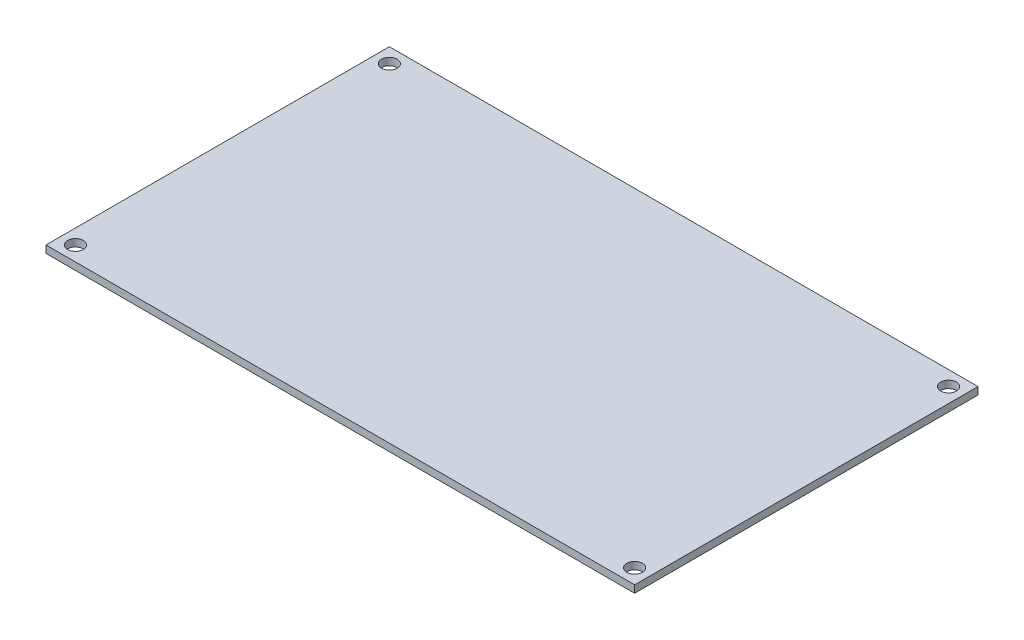
ISO-10303-21;
HEADER;
FILE_DESCRIPTION(('STEP AP214'),'2;1');
FILE_NAME('part.step','',(''),(''),'','','');
FILE_SCHEMA(('AUTOMOTIVE_DESIGN { 1 0 10303 214 1 1 1 1 }'));
ENDSEC;
DATA;
#1=APPLICATION_CONTEXT('core data for automotive mechanical design processes');
#2=APPLICATION_PROTOCOL_DEFINITION('international standard','automotive_design',2000,#1);
#3=PRODUCT_CONTEXT('',#1,'mechanical');
#4=PRODUCT('Part','Part','',(#3));
#5=PRODUCT_RELATED_PRODUCT_CATEGORY('part','',(#4));
#6=PRODUCT_DEFINITION_FORMATION('','',#4);
#7=PRODUCT_DEFINITION_CONTEXT('part definition',#1,'design');
#8=PRODUCT_DEFINITION('design','',#6,#7);
#9=PRODUCT_DEFINITION_SHAPE('','',#8);
#10=(LENGTH_UNIT() NAMED_UNIT(*) SI_UNIT(.MILLI.,.METRE.));
#11=(NAMED_UNIT(*) PLANE_ANGLE_UNIT() SI_UNIT($,.RADIAN.));
#12=(NAMED_UNIT(*) SI_UNIT($,.STERADIAN.) SOLID_ANGLE_UNIT());
#13=UNCERTAINTY_MEASURE_WITH_UNIT(LENGTH_MEASURE(1.E-05),#10,'distance_accuracy_value','');
#14=(GEOMETRIC_REPRESENTATION_CONTEXT(3) GLOBAL_UNCERTAINTY_ASSIGNED_CONTEXT((#13)) GLOBAL_UNIT_ASSIGNED_CONTEXT((#10,
#11,#12)) REPRESENTATION_CONTEXT('',''));
#15=CARTESIAN_POINT('',(0.,0.,0.));
#16=DIRECTION('',(0.,0.,1.));
#17=DIRECTION('',(1.,0.,0.));
#18=AXIS2_PLACEMENT_3D('',#15,#16,#17);
#19=CARTESIAN_POINT('',(-60.,1.5,-35.));
#20=DIRECTION('',(1.,0.,0.));
#21=DIRECTION('',(0.,0.,-1.));
#22=AXIS2_PLACEMENT_3D('',#19,#20,#21);
#23=PLANE('',#22);
#24=DIRECTION('',(0.,0.,1.));
#25=VECTOR('',#24,1.);
#26=CARTESIAN_POINT('',(-60.,0.,-35.));
#27=LINE('',#26,#25);
#28=CARTESIAN_POINT('',(-60.,0.,-35.));
#29=VERTEX_POINT('',#28);
#30=CARTESIAN_POINT('',(-60.,0.,35.));
#31=VERTEX_POINT('',#30);
#32=EDGE_CURVE('E97',#29,#31,#27,.T.);
#33=ORIENTED_EDGE('',*,*,#32,.T.);
#34=DIRECTION('',(0.,-1.,0.));
#35=VECTOR('',#34,1.);
#36=CARTESIAN_POINT('',(-60.,1.5,35.));
#37=LINE('',#36,#35);
#38=CARTESIAN_POINT('',(-60.,1.5,35.));
#39=VERTEX_POINT('',#38);
#40=EDGE_CURVE('E11',#39,#31,#37,.T.);
#41=ORIENTED_EDGE('',*,*,#40,.F.);
#42=DIRECTION('',(0.,0.,1.));
#43=VECTOR('',#42,1.);
#44=CARTESIAN_POINT('',(-60.,1.5,-35.));
#45=LINE('',#44,#43);
#46=CARTESIAN_POINT('',(-60.,1.5,-35.));
#47=VERTEX_POINT('',#46);
#48=EDGE_CURVE('E85',#47,#39,#45,.T.);
#49=ORIENTED_EDGE('',*,*,#48,.F.);
#50=DIRECTION('',(0.,-1.,0.));
#51=VECTOR('',#50,1.);
#52=CARTESIAN_POINT('',(-60.,1.5,-35.));
#53=LINE('',#52,#51);
#54=EDGE_CURVE('E93',#47,#29,#53,.T.);
#55=ORIENTED_EDGE('',*,*,#54,.T.);
#56=EDGE_LOOP('',(#33,#41,#49,#55));
#57=FACE_BOUND('',#56,.T.);
#58=ADVANCED_FACE('F34',(#57),#23,.F.);
#59=CARTESIAN_POINT('',(-60.,1.5,35.));
#60=DIRECTION('',(0.,0.,-1.));
#61=DIRECTION('',(-1.,0.,0.));
#62=AXIS2_PLACEMENT_3D('',#59,#60,#61);
#63=PLANE('',#62);
#64=DIRECTION('',(1.,0.,0.));
#65=VECTOR('',#64,1.);
#66=CARTESIAN_POINT('',(-60.,0.,35.));
#67=LINE('',#66,#65);
#68=CARTESIAN_POINT('',(60.,0.,35.));
#69=VERTEX_POINT('',#68);
#70=EDGE_CURVE('E89',#31,#69,#67,.T.);
#71=ORIENTED_EDGE('',*,*,#70,.T.);
#72=DIRECTION('',(0.,-1.,0.));
#73=VECTOR('',#72,1.);
#74=CARTESIAN_POINT('',(60.,1.5,35.));
#75=LINE('',#74,#73);
#76=CARTESIAN_POINT('',(60.,1.5,35.));
#77=VERTEX_POINT('',#76);
#78=EDGE_CURVE('E42',#77,#69,#75,.T.);
#79=ORIENTED_EDGE('',*,*,#78,.F.);
#80=DIRECTION('',(1.,0.,0.));
#81=VECTOR('',#80,1.);
#82=CARTESIAN_POINT('',(-60.,1.5,35.));
#83=LINE('',#82,#81);
#84=EDGE_CURVE('E80',#39,#77,#83,.T.);
#85=ORIENTED_EDGE('',*,*,#84,.F.);
#86=ORIENTED_EDGE('',*,*,#40,.T.);
#87=EDGE_LOOP('',(#71,#79,#85,#86));
#88=FACE_BOUND('',#87,.T.);
#89=ADVANCED_FACE('F88',(#88),#63,.F.);
#90=CARTESIAN_POINT('',(60.,1.5,-35.));
#91=DIRECTION('',(-1.,0.,0.));
#92=DIRECTION('',(0.,0.,1.));
#93=AXIS2_PLACEMENT_3D('',#90,#91,#92);
#94=PLANE('',#93);
#95=DIRECTION('',(0.,0.,-1.));
#96=VECTOR('',#95,1.);
#97=CARTESIAN_POINT('',(60.,0.,-35.));
#98=LINE('',#97,#96);
#99=CARTESIAN_POINT('',(60.,0.,-35.));
#100=VERTEX_POINT('',#99);
#101=EDGE_CURVE('E67',#69,#100,#98,.T.);
#102=ORIENTED_EDGE('',*,*,#101,.T.);
#103=DIRECTION('',(0.,-1.,0.));
#104=VECTOR('',#103,1.);
#105=CARTESIAN_POINT('',(60.,1.5,-35.));
#106=LINE('',#105,#104);
#107=CARTESIAN_POINT('',(60.,1.5,-35.));
#108=VERTEX_POINT('',#107);
#109=EDGE_CURVE('E90',#108,#100,#106,.T.);
#110=ORIENTED_EDGE('',*,*,#109,.F.);
#111=DIRECTION('',(0.,0.,-1.));
#112=VECTOR('',#111,1.);
#113=CARTESIAN_POINT('',(60.,1.5,-35.));
#114=LINE('',#113,#112);
#115=EDGE_CURVE('E83',#77,#108,#114,.T.);
#116=ORIENTED_EDGE('',*,*,#115,.F.);
#117=ORIENTED_EDGE('',*,*,#78,.T.);
#118=EDGE_LOOP('',(#102,#110,#116,#117));
#119=FACE_BOUND('',#118,.T.);
#120=ADVANCED_FACE('F91',(#119),#94,.F.);
#121=CARTESIAN_POINT('',(-60.,1.5,-35.));
#122=DIRECTION('',(0.,0.,1.));
#123=DIRECTION('',(1.,0.,0.));
#124=AXIS2_PLACEMENT_3D('',#121,#122,#123);
#125=PLANE('',#124);
#126=DIRECTION('',(-1.,0.,0.));
#127=VECTOR('',#126,1.);
#128=CARTESIAN_POINT('',(-60.,0.,-35.));
#129=LINE('',#128,#127);
#130=EDGE_CURVE('E73',#100,#29,#129,.T.);
#131=ORIENTED_EDGE('',*,*,#130,.T.);
#132=ORIENTED_EDGE('',*,*,#54,.F.);
#133=DIRECTION('',(-1.,0.,0.));
#134=VECTOR('',#133,1.);
#135=CARTESIAN_POINT('',(-60.,1.5,-35.));
#136=LINE('',#135,#134);
#137=EDGE_CURVE('E50',#108,#47,#136,.T.);
#138=ORIENTED_EDGE('',*,*,#137,.F.);
#139=ORIENTED_EDGE('',*,*,#109,.T.);
#140=EDGE_LOOP('',(#131,#132,#138,#139));
#141=FACE_BOUND('',#140,.T.);
#142=ADVANCED_FACE('F105',(#141),#125,.F.);
#143=CARTESIAN_POINT('',(0.,1.5,0.));
#144=DIRECTION('',(0.,1.,0.));
#145=DIRECTION('',(0.,0.,1.));
#146=AXIS2_PLACEMENT_3D('',#143,#144,#145);
#147=PLANE('',#146);
#148=CARTESIAN_POINT('',(-57.,1.5,32.));
#149=DIRECTION('',(0.,1.,0.));
#150=DIRECTION('',(0.,0.,1.));
#151=AXIS2_PLACEMENT_3D('',#148,#149,#150);
#152=CIRCLE('',#151,1.6);
#153=CARTESIAN_POINT('',(-57.,1.5,33.6));
#154=VERTEX_POINT('',#153);
#155=EDGE_CURVE('E131',#154,#154,#152,.T.);
#156=ORIENTED_EDGE('',*,*,#155,.F.);
#157=EDGE_LOOP('',(#156));
#158=FACE_BOUND('',#157,.T.);
#159=CARTESIAN_POINT('',(57.,1.5,-32.));
#160=DIRECTION('',(0.,1.,0.));
#161=DIRECTION('',(0.,0.,1.));
#162=AXIS2_PLACEMENT_3D('',#159,#160,#161);
#163=CIRCLE('',#162,1.6);
#164=CARTESIAN_POINT('',(57.,1.5,-30.4));
#165=VERTEX_POINT('',#164);
#166=EDGE_CURVE('E125',#165,#165,#163,.T.);
#167=ORIENTED_EDGE('',*,*,#166,.F.);
#168=EDGE_LOOP('',(#167));
#169=FACE_BOUND('',#168,.T.);
#170=CARTESIAN_POINT('',(57.,1.5,32.));
#171=DIRECTION('',(0.,1.,0.));
#172=DIRECTION('',(0.,0.,1.));
#173=AXIS2_PLACEMENT_3D('',#170,#171,#172);
#174=CIRCLE('',#173,1.6);
#175=CARTESIAN_POINT('',(57.,1.5,33.6));
#176=VERTEX_POINT('',#175);
#177=EDGE_CURVE('E119',#176,#176,#174,.T.);
#178=ORIENTED_EDGE('',*,*,#177,.F.);
#179=EDGE_LOOP('',(#178));
#180=FACE_BOUND('',#179,.T.);
#181=CARTESIAN_POINT('',(-57.,1.5,-32.));
#182=DIRECTION('',(0.,1.,0.));
#183=DIRECTION('',(0.,0.,1.));
#184=AXIS2_PLACEMENT_3D('',#181,#182,#183);
#185=CIRCLE('',#184,1.6);
#186=CARTESIAN_POINT('',(-57.,1.5,-30.4));
#187=VERTEX_POINT('',#186);
#188=EDGE_CURVE('E113',#187,#187,#185,.T.);
#189=ORIENTED_EDGE('',*,*,#188,.F.);
#190=EDGE_LOOP('',(#189));
#191=FACE_BOUND('',#190,.T.);
#192=ORIENTED_EDGE('',*,*,#48,.T.);
#193=ORIENTED_EDGE('',*,*,#84,.T.);
#194=ORIENTED_EDGE('',*,*,#115,.T.);
#195=ORIENTED_EDGE('',*,*,#137,.T.);
#196=EDGE_LOOP('',(#192,#193,#194,#195));
#197=FACE_BOUND('',#196,.T.);
#198=ADVANCED_FACE('F81',(#158,#169,#180,#191,#197),#147,.T.);
#199=CARTESIAN_POINT('',(0.,0.,0.));
#200=DIRECTION('',(0.,1.,0.));
#201=DIRECTION('',(0.,0.,1.));
#202=AXIS2_PLACEMENT_3D('',#199,#200,#201);
#203=PLANE('',#202);
#204=CARTESIAN_POINT('',(-57.,0.,32.));
#205=DIRECTION('',(0.,1.,0.));
#206=DIRECTION('',(0.,0.,1.));
#207=AXIS2_PLACEMENT_3D('',#204,#205,#206);
#208=CIRCLE('',#207,1.6);
#209=CARTESIAN_POINT('',(-57.,0.,33.6));
#210=VERTEX_POINT('',#209);
#211=EDGE_CURVE('E128',#210,#210,#208,.F.);
#212=ORIENTED_EDGE('',*,*,#211,.F.);
#213=EDGE_LOOP('',(#212));
#214=FACE_BOUND('',#213,.T.);
#215=CARTESIAN_POINT('',(57.,0.,-32.));
#216=DIRECTION('',(0.,1.,0.));
#217=DIRECTION('',(0.,0.,1.));
#218=AXIS2_PLACEMENT_3D('',#215,#216,#217);
#219=CIRCLE('',#218,1.6);
#220=CARTESIAN_POINT('',(57.,0.,-30.4));
#221=VERTEX_POINT('',#220);
#222=EDGE_CURVE('E122',#221,#221,#219,.F.);
#223=ORIENTED_EDGE('',*,*,#222,.F.);
#224=EDGE_LOOP('',(#223));
#225=FACE_BOUND('',#224,.T.);
#226=CARTESIAN_POINT('',(57.,0.,32.));
#227=DIRECTION('',(0.,1.,0.));
#228=DIRECTION('',(0.,0.,1.));
#229=AXIS2_PLACEMENT_3D('',#226,#227,#228);
#230=CIRCLE('',#229,1.6);
#231=CARTESIAN_POINT('',(57.,0.,33.6));
#232=VERTEX_POINT('',#231);
#233=EDGE_CURVE('E116',#232,#232,#230,.F.);
#234=ORIENTED_EDGE('',*,*,#233,.F.);
#235=EDGE_LOOP('',(#234));
#236=FACE_BOUND('',#235,.T.);
#237=CARTESIAN_POINT('',(-57.,0.,-32.));
#238=DIRECTION('',(0.,1.,0.));
#239=DIRECTION('',(0.,0.,1.));
#240=AXIS2_PLACEMENT_3D('',#237,#238,#239);
#241=CIRCLE('',#240,1.6);
#242=CARTESIAN_POINT('',(-57.,0.,-30.4));
#243=VERTEX_POINT('',#242);
#244=EDGE_CURVE('E100',#243,#243,#241,.F.);
#245=ORIENTED_EDGE('',*,*,#244,.F.);
#246=EDGE_LOOP('',(#245));
#247=FACE_BOUND('',#246,.T.);
#248=ORIENTED_EDGE('',*,*,#32,.F.);
#249=ORIENTED_EDGE('',*,*,#130,.F.);
#250=ORIENTED_EDGE('',*,*,#101,.F.);
#251=ORIENTED_EDGE('',*,*,#70,.F.);
#252=EDGE_LOOP('',(#248,#249,#250,#251));
#253=FACE_BOUND('',#252,.T.);
#254=ADVANCED_FACE('F108',(#214,#225,#236,#247,#253),#203,.F.);
#255=CARTESIAN_POINT('',(-57.,-4.5254833995939,-32.));
#256=DIRECTION('',(0.,1.,0.));
#257=DIRECTION('',(0.,0.,1.));
#258=AXIS2_PLACEMENT_3D('',#255,#256,#257);
#259=CYLINDRICAL_SURFACE('',#258,1.6);
#260=ORIENTED_EDGE('',*,*,#244,.T.);
#261=EDGE_LOOP('',(#260));
#262=FACE_BOUND('',#261,.T.);
#263=ORIENTED_EDGE('',*,*,#188,.T.);
#264=EDGE_LOOP('',(#263));
#265=FACE_BOUND('',#264,.T.);
#266=ADVANCED_FACE('F146',(#262,#265),#259,.F.);
#267=CARTESIAN_POINT('',(57.,-4.5254833995939,32.));
#268=DIRECTION('',(0.,1.,0.));
#269=DIRECTION('',(0.,0.,1.));
#270=AXIS2_PLACEMENT_3D('',#267,#268,#269);
#271=CYLINDRICAL_SURFACE('',#270,1.6);
#272=ORIENTED_EDGE('',*,*,#233,.T.);
#273=EDGE_LOOP('',(#272));
#274=FACE_BOUND('',#273,.T.);
#275=ORIENTED_EDGE('',*,*,#177,.T.);
#276=EDGE_LOOP('',(#275));
#277=FACE_BOUND('',#276,.T.);
#278=ADVANCED_FACE('F148',(#274,#277),#271,.F.);
#279=CARTESIAN_POINT('',(57.,-4.5254833995939,-32.));
#280=DIRECTION('',(0.,1.,0.));
#281=DIRECTION('',(0.,0.,1.));
#282=AXIS2_PLACEMENT_3D('',#279,#280,#281);
#283=CYLINDRICAL_SURFACE('',#282,1.6);
#284=ORIENTED_EDGE('',*,*,#222,.T.);
#285=EDGE_LOOP('',(#284));
#286=FACE_BOUND('',#285,.T.);
#287=ORIENTED_EDGE('',*,*,#166,.T.);
#288=EDGE_LOOP('',(#287));
#289=FACE_BOUND('',#288,.T.);
#290=ADVANCED_FACE('F155',(#286,#289),#283,.F.);
#291=CARTESIAN_POINT('',(-57.,-4.5254833995939,32.));
#292=DIRECTION('',(0.,1.,0.));
#293=DIRECTION('',(0.,0.,1.));
#294=AXIS2_PLACEMENT_3D('',#291,#292,#293);
#295=CYLINDRICAL_SURFACE('',#294,1.6);
#296=ORIENTED_EDGE('',*,*,#211,.T.);
#297=EDGE_LOOP('',(#296));
#298=FACE_BOUND('',#297,.T.);
#299=ORIENTED_EDGE('',*,*,#155,.T.);
#300=EDGE_LOOP('',(#299));
#301=FACE_BOUND('',#300,.T.);
#302=ADVANCED_FACE('F135',(#298,#301),#295,.F.);
#303=CLOSED_SHELL('',(#58,#89,#120,#142,#198,#254,#266,#278,#290,#302));
#304=MANIFOLD_SOLID_BREP('B2',#303);
#305=ADVANCED_BREP_SHAPE_REPRESENTATION('',(#18,#304),#14);
#306=SHAPE_DEFINITION_REPRESENTATION(#9,#305);
ENDSEC;
END-ISO-10303-21;
